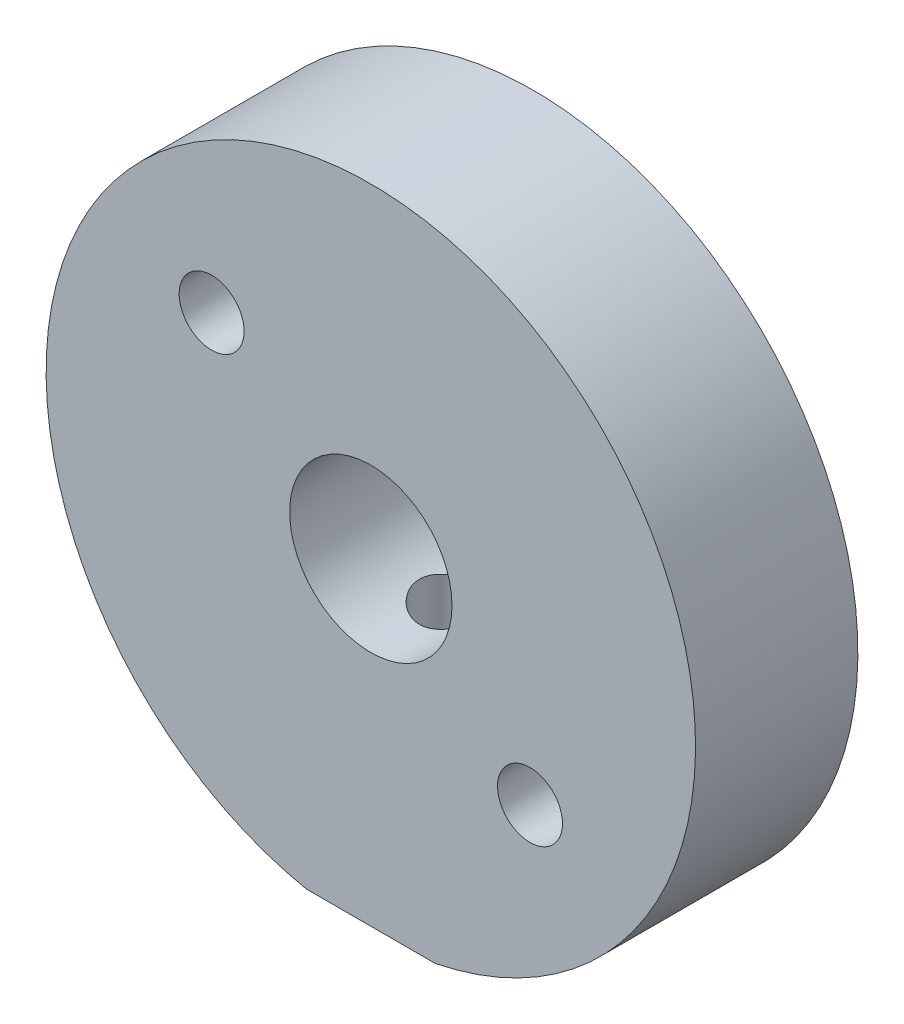
ISO-10303-21;
HEADER;
FILE_DESCRIPTION(('STEP AP214'),'2;1');
FILE_NAME('part.step','',(''),(''),'','','');
FILE_SCHEMA(('AUTOMOTIVE_DESIGN { 1 0 10303 214 1 1 1 1 }'));
ENDSEC;
DATA;
#1=APPLICATION_CONTEXT('core data for automotive mechanical design processes');
#2=APPLICATION_PROTOCOL_DEFINITION('international standard','automotive_design',2000,#1);
#3=PRODUCT_CONTEXT('',#1,'mechanical');
#4=PRODUCT('Part','Part','',(#3));
#5=PRODUCT_RELATED_PRODUCT_CATEGORY('part','',(#4));
#6=PRODUCT_DEFINITION_FORMATION('','',#4);
#7=PRODUCT_DEFINITION_CONTEXT('part definition',#1,'design');
#8=PRODUCT_DEFINITION('design','',#6,#7);
#9=PRODUCT_DEFINITION_SHAPE('','',#8);
#10=(LENGTH_UNIT() NAMED_UNIT(*) SI_UNIT(.MILLI.,.METRE.));
#11=(NAMED_UNIT(*) PLANE_ANGLE_UNIT() SI_UNIT($,.RADIAN.));
#12=(NAMED_UNIT(*) SI_UNIT($,.STERADIAN.) SOLID_ANGLE_UNIT());
#13=UNCERTAINTY_MEASURE_WITH_UNIT(LENGTH_MEASURE(1.E-05),#10,'distance_accuracy_value','');
#14=(GEOMETRIC_REPRESENTATION_CONTEXT(3) GLOBAL_UNCERTAINTY_ASSIGNED_CONTEXT((#13)) GLOBAL_UNIT_ASSIGNED_CONTEXT((#10,
#11,#12)) REPRESENTATION_CONTEXT('',''));
#15=CARTESIAN_POINT('',(0.,0.,0.));
#16=DIRECTION('',(0.,0.,1.));
#17=DIRECTION('',(1.,0.,0.));
#18=AXIS2_PLACEMENT_3D('',#15,#16,#17);
#19=CARTESIAN_POINT('',(0.,0.,1.25));
#20=DIRECTION('',(0.,0.,1.));
#21=DIRECTION('',(1.,0.,0.));
#22=AXIS2_PLACEMENT_3D('',#19,#20,#21);
#23=PLANE('',#22);
#24=DIRECTION('',(-1.,0.,0.));
#25=VECTOR('',#24,1.);
#26=CARTESIAN_POINT('',(0.,-4.9,1.25));
#27=LINE('',#26,#25);
#28=CARTESIAN_POINT('',(0.994987437106618,-4.9,1.25));
#29=VERTEX_POINT('',#28);
#30=CARTESIAN_POINT('',(-0.994987437106618,-4.9,1.25));
#31=VERTEX_POINT('',#30);
#32=EDGE_CURVE('E52',#29,#31,#27,.T.);
#33=ORIENTED_EDGE('',*,*,#32,.F.);
#34=CARTESIAN_POINT('',(0.,0.,1.25));
#35=DIRECTION('',(0.,0.,1.));
#36=DIRECTION('',(1.,0.,0.));
#37=AXIS2_PLACEMENT_3D('',#34,#35,#36);
#38=CIRCLE('',#37,5.);
#39=EDGE_CURVE('E11',#29,#31,#38,.T.);
#40=ORIENTED_EDGE('',*,*,#39,.T.);
#41=EDGE_LOOP('',(#33,#40));
#42=FACE_BOUND('',#41,.T.);
#43=CARTESIAN_POINT('',(-2.45134221797273,2.05692035100051,1.25));
#44=DIRECTION('',(0.,0.,1.));
#45=DIRECTION('',(1.,0.,0.));
#46=AXIS2_PLACEMENT_3D('',#43,#44,#45);
#47=CIRCLE('',#46,0.5);
#48=CARTESIAN_POINT('',(-1.95134221797273,2.05692035100051,1.25));
#49=VERTEX_POINT('',#48);
#50=EDGE_CURVE('E78',#49,#49,#47,.T.);
#51=ORIENTED_EDGE('',*,*,#50,.F.);
#52=EDGE_LOOP('',(#51));
#53=FACE_BOUND('',#52,.T.);
#54=CARTESIAN_POINT('',(2.45134221797309,-2.05692035100051,1.25));
#55=DIRECTION('',(0.,0.,1.));
#56=DIRECTION('',(1.,0.,0.));
#57=AXIS2_PLACEMENT_3D('',#54,#55,#56);
#58=CIRCLE('',#57,0.5);
#59=CARTESIAN_POINT('',(2.95134221797309,-2.05692035100051,1.25));
#60=VERTEX_POINT('',#59);
#61=EDGE_CURVE('E86',#60,#60,#58,.T.);
#62=ORIENTED_EDGE('',*,*,#61,.F.);
#63=EDGE_LOOP('',(#62));
#64=FACE_BOUND('',#63,.T.);
#65=CARTESIAN_POINT('',(0.,0.,1.25));
#66=DIRECTION('',(0.,0.,1.));
#67=DIRECTION('',(1.,0.,0.));
#68=AXIS2_PLACEMENT_3D('',#65,#66,#67);
#69=CIRCLE('',#68,1.25);
#70=CARTESIAN_POINT('',(1.25,0.,1.25));
#71=VERTEX_POINT('',#70);
#72=EDGE_CURVE('E91',#71,#71,#69,.T.);
#73=ORIENTED_EDGE('',*,*,#72,.F.);
#74=EDGE_LOOP('',(#73));
#75=FACE_BOUND('',#74,.T.);
#76=ADVANCED_FACE('F35',(#42,#53,#64,#75),#23,.T.);
#77=CARTESIAN_POINT('',(0.,0.,-1.25));
#78=DIRECTION('',(0.,0.,1.));
#79=DIRECTION('',(1.,0.,0.));
#80=AXIS2_PLACEMENT_3D('',#77,#78,#79);
#81=PLANE('',#80);
#82=CARTESIAN_POINT('',(-2.45134221797273,2.05692035100051,-1.25));
#83=DIRECTION('',(0.,0.,1.));
#84=DIRECTION('',(1.,0.,0.));
#85=AXIS2_PLACEMENT_3D('',#82,#83,#84);
#86=CIRCLE('',#85,0.5);
#87=CARTESIAN_POINT('',(-1.95134221797273,2.05692035100051,-1.25));
#88=VERTEX_POINT('',#87);
#89=EDGE_CURVE('E81',#88,#88,#86,.T.);
#90=ORIENTED_EDGE('',*,*,#89,.T.);
#91=EDGE_LOOP('',(#90));
#92=FACE_BOUND('',#91,.T.);
#93=CARTESIAN_POINT('',(2.45134221797309,-2.05692035100051,-1.25));
#94=DIRECTION('',(0.,0.,1.));
#95=DIRECTION('',(1.,0.,0.));
#96=AXIS2_PLACEMENT_3D('',#93,#94,#95);
#97=CIRCLE('',#96,0.5);
#98=CARTESIAN_POINT('',(2.95134221797309,-2.05692035100051,-1.25));
#99=VERTEX_POINT('',#98);
#100=EDGE_CURVE('E82',#99,#99,#97,.T.);
#101=ORIENTED_EDGE('',*,*,#100,.T.);
#102=EDGE_LOOP('',(#101));
#103=FACE_BOUND('',#102,.T.);
#104=CARTESIAN_POINT('',(0.,0.,-1.25));
#105=DIRECTION('',(0.,0.,1.));
#106=DIRECTION('',(1.,0.,0.));
#107=AXIS2_PLACEMENT_3D('',#104,#105,#106);
#108=CIRCLE('',#107,5.);
#109=CARTESIAN_POINT('',(0.994987437106618,-4.9,-1.25));
#110=VERTEX_POINT('',#109);
#111=CARTESIAN_POINT('',(-0.994987437106618,-4.9,-1.25));
#112=VERTEX_POINT('',#111);
#113=EDGE_CURVE('E44',#110,#112,#108,.T.);
#114=ORIENTED_EDGE('',*,*,#113,.F.);
#115=DIRECTION('',(-1.,0.,0.));
#116=VECTOR('',#115,1.);
#117=CARTESIAN_POINT('',(0.,-4.9,-1.25));
#118=LINE('',#117,#116);
#119=EDGE_CURVE('E64',#110,#112,#118,.T.);
#120=ORIENTED_EDGE('',*,*,#119,.T.);
#121=EDGE_LOOP('',(#114,#120));
#122=FACE_BOUND('',#121,.T.);
#123=CARTESIAN_POINT('',(0.,0.,-1.25));
#124=DIRECTION('',(0.,0.,1.));
#125=DIRECTION('',(1.,0.,0.));
#126=AXIS2_PLACEMENT_3D('',#123,#124,#125);
#127=CIRCLE('',#126,1.25);
#128=CARTESIAN_POINT('',(1.25,0.,-1.25));
#129=VERTEX_POINT('',#128);
#130=EDGE_CURVE('E85',#129,#129,#127,.T.);
#131=ORIENTED_EDGE('',*,*,#130,.T.);
#132=EDGE_LOOP('',(#131));
#133=FACE_BOUND('',#132,.T.);
#134=ADVANCED_FACE('F124',(#92,#103,#122,#133),#81,.F.);
#135=CARTESIAN_POINT('',(0.,0.,1.25));
#136=DIRECTION('',(0.,0.,-1.));
#137=DIRECTION('',(-1.,0.,0.));
#138=AXIS2_PLACEMENT_3D('',#135,#136,#137);
#139=CYLINDRICAL_SURFACE('',#138,5.);
#140=ORIENTED_EDGE('',*,*,#39,.F.);
#141=DIRECTION('',(0.,0.,-1.));
#142=VECTOR('',#141,1.);
#143=CARTESIAN_POINT('',(0.994987437106618,-4.9,1.25));
#144=LINE('',#143,#142);
#145=EDGE_CURVE('E62',#29,#110,#144,.T.);
#146=ORIENTED_EDGE('',*,*,#145,.T.);
#147=ORIENTED_EDGE('',*,*,#113,.T.);
#148=DIRECTION('',(0.,0.,-1.));
#149=VECTOR('',#148,1.);
#150=CARTESIAN_POINT('',(-0.994987437106618,-4.9,1.25));
#151=LINE('',#150,#149);
#152=EDGE_CURVE('E56',#112,#31,#151,.F.);
#153=ORIENTED_EDGE('',*,*,#152,.T.);
#154=EDGE_LOOP('',(#140,#146,#147,#153));
#155=FACE_BOUND('',#154,.T.);
#156=ADVANCED_FACE('F37',(#155),#139,.T.);
#157=CARTESIAN_POINT('',(0.,0.,1.25));
#158=DIRECTION('',(0.,0.,-1.));
#159=DIRECTION('',(-1.,0.,0.));
#160=AXIS2_PLACEMENT_3D('',#157,#158,#159);
#161=CYLINDRICAL_SURFACE('',#160,1.25);
#162=CARTESIAN_POINT('',(0.,-1.25,0.5));
#163=CARTESIAN_POINT('',(0.0268732513607228,-1.24999817806771,0.499997537044069));
#164=CARTESIAN_POINT('',(0.0537931410226683,-1.24912323576733,0.497820561977906));
#165=CARTESIAN_POINT('',(0.106874120104474,-1.2457086327516,0.489188074119691));
#166=CARTESIAN_POINT('',(0.133032944390312,-1.24316444674719,0.482720930228467));
#167=CARTESIAN_POINT('',(0.183738480681851,-1.2366855230328,0.465780980485292));
#168=CARTESIAN_POINT('',(0.20829016540424,-1.23275534091018,0.455321288445817));
#169=CARTESIAN_POINT('',(0.255267992582092,-1.22389152699019,0.430745206668363));
#170=CARTESIAN_POINT('',(0.277694869187748,-1.21895824364514,0.416630086270267));
#171=CARTESIAN_POINT('',(0.320875251892598,-1.20832721542605,0.384441125359766));
#172=CARTESIAN_POINT('',(0.341515568137553,-1.20260574232298,0.366223335939934));
#173=CARTESIAN_POINT('',(0.379543751196181,-1.19115144226549,0.326649999130806));
#174=CARTESIAN_POINT('',(0.396930026783383,-1.18541861113448,0.305292925697065));
#175=CARTESIAN_POINT('',(0.42871864182322,-1.17430697949284,0.258892982439433));
#176=CARTESIAN_POINT('',(0.442953745298868,-1.16895528991238,0.233728378494201));
#177=CARTESIAN_POINT('',(0.466938679759287,-1.15958411796698,0.181115900394989));
#178=CARTESIAN_POINT('',(0.476690641071459,-1.15556400311044,0.15366911803791));
#179=CARTESIAN_POINT('',(0.490974705848967,-1.14956589415205,0.0985719166019743));
#180=CARTESIAN_POINT('',(0.495723491451412,-1.14750355088901,0.0709871911059467));
#181=CARTESIAN_POINT('',(0.500543240410007,-1.14541001012286,0.0153412504231831));
#182=CARTESIAN_POINT('',(0.500616504078305,-1.14537781380692,-0.0127197236562537));
#183=CARTESIAN_POINT('',(0.496247341876136,-1.14727625069999,-0.066439167864511));
#184=CARTESIAN_POINT('',(0.492118828576284,-1.14907043759613,-0.0921289286022577));
#185=CARTESIAN_POINT('',(0.479986720074455,-1.15419046901959,-0.142414889001678));
#186=CARTESIAN_POINT('',(0.471982448701158,-1.15751658080418,-0.167010897027577));
#187=CARTESIAN_POINT('',(0.452173683137768,-1.16539871272133,-0.21500445904901));
#188=CARTESIAN_POINT('',(0.440294965578829,-1.16997844820197,-0.238367309763673));
#189=CARTESIAN_POINT('',(0.413126615183053,-1.17984529097472,-0.282853954090391));
#190=CARTESIAN_POINT('',(0.397835701275211,-1.18513266364212,-0.303976902350702));
#191=CARTESIAN_POINT('',(0.362887649863608,-1.19631684185568,-0.345102432200499));
#192=CARTESIAN_POINT('',(0.342984365742659,-1.20222916244038,-0.364892182361504));
#193=CARTESIAN_POINT('',(0.300078606857548,-1.21364956239571,-0.40092111950051));
#194=CARTESIAN_POINT('',(0.277075516333608,-1.21915756111331,-0.417159599352573));
#195=CARTESIAN_POINT('',(0.228019413151461,-1.22928670316137,-0.445904361853958));
#196=CARTESIAN_POINT('',(0.201915122836619,-1.23388817523854,-0.458330570299263));
#197=CARTESIAN_POINT('',(0.147755941370721,-1.2415370708219,-0.478541965269514));
#198=CARTESIAN_POINT('',(0.119702049212419,-1.24458528365595,-0.486329509389353));
#199=CARTESIAN_POINT('',(0.0642239719019548,-1.24864034876728,-0.496612073854926));
#200=CARTESIAN_POINT('',(0.0368608234963826,-1.2497573645838,-0.499393113563388));
#201=CARTESIAN_POINT('',(-0.0179613274519531,-1.25017119627656,-0.500428275132156));
#202=CARTESIAN_POINT('',(-0.0454203033059766,-1.24946848395566,-0.498683570386886));
#203=CARTESIAN_POINT('',(-0.0983581847805009,-1.24639391765945,-0.490927061861994));
#204=CARTESIAN_POINT('',(-0.123870622943883,-1.24409847836405,-0.485110504912227));
#205=CARTESIAN_POINT('',(-0.17353385701518,-1.23814860351351,-0.469641072922576));
#206=CARTESIAN_POINT('',(-0.197684477556156,-1.23449399339042,-0.459987705082938));
#207=CARTESIAN_POINT('',(-0.244769696454232,-1.22604148692796,-0.436803765079902));
#208=CARTESIAN_POINT('',(-0.267644505689066,-1.22121203995305,-0.423163631988793));
#209=CARTESIAN_POINT('',(-0.310860897811424,-1.21093341186027,-0.392514919024009));
#210=CARTESIAN_POINT('',(-0.33120146018948,-1.20548398276245,-0.375504989270917));
#211=CARTESIAN_POINT('',(-0.370180760758058,-1.19411279410938,-0.337282496760919));
#212=CARTESIAN_POINT('',(-0.3886184834548,-1.18818360361687,-0.315866614617007));
#213=CARTESIAN_POINT('',(-0.421687799350143,-1.17685418223858,-0.2701399792541));
#214=CARTESIAN_POINT('',(-0.436318765322091,-1.17145403861338,-0.245828749939108));
#215=CARTESIAN_POINT('',(-0.461451875492365,-1.16178574997527,-0.194634576333148));
#216=CARTESIAN_POINT('',(-0.471912648675241,-1.15752907798208,-0.167729000118263));
#217=CARTESIAN_POINT('',(-0.488074054968611,-1.15080918446056,-0.112316586989208));
#218=CARTESIAN_POINT('',(-0.49377820132833,-1.14834463943799,-0.0838109485218558));
#219=CARTESIAN_POINT('',(-0.499928904310196,-1.14567939806572,-0.0282180245723256));
#220=CARTESIAN_POINT('',(-0.5007242705732,-1.14532855247117,-0.00117629010593323));
#221=CARTESIAN_POINT('',(-0.497950789821897,-1.146537090132,0.0526362144325935));
#222=CARTESIAN_POINT('',(-0.494382496979107,-1.14809623082494,0.0794070184767689));
#223=CARTESIAN_POINT('',(-0.483267841537776,-1.15281662268511,0.130833047462682));
#224=CARTESIAN_POINT('',(-0.475884373392574,-1.15591207956528,0.15553006860796));
#225=CARTESIAN_POINT('',(-0.457501362122924,-1.16331000308508,0.20334465740366));
#226=CARTESIAN_POINT('',(-0.4465008203485,-1.16761280301594,0.226461786725036));
#227=CARTESIAN_POINT('',(-0.420468190689883,-1.17724652401026,0.27190240481761));
#228=CARTESIAN_POINT('',(-0.405241333789859,-1.18262220578284,0.294104667532598));
#229=CARTESIAN_POINT('',(-0.371473029817887,-1.19365951093085,0.335748329300961));
#230=CARTESIAN_POINT('',(-0.352930583704534,-1.19932122012109,0.355188893032085));
#231=CARTESIAN_POINT('',(-0.311626376568112,-1.21073391771841,0.392050713315897));
#232=CARTESIAN_POINT('',(-0.288669000286534,-1.21646689490544,0.409259326724515));
#233=CARTESIAN_POINT('',(-0.239975080071446,-1.22700101678431,0.439584260655411));
#234=CARTESIAN_POINT('',(-0.21423725113681,-1.23180172773227,0.452698678038133));
#235=CARTESIAN_POINT('',(-0.1611845156238,-1.23984928703965,0.474155553797572));
#236=CARTESIAN_POINT('',(-0.133907904554924,-1.24312340763757,0.482582330890084));
#237=CARTESIAN_POINT('',(-0.078219136570305,-1.24786076552342,0.494659780238567));
#238=CARTESIAN_POINT('',(-0.0498108814647279,-1.24932974873909,0.498325609185975));
#239=CARTESIAN_POINT('',(-0.0142280744727323,-1.24993974876034,0.499848845244569));
#240=CARTESIAN_POINT('',(-0.00711567218518954,-1.25000048242294,0.500000652157299));
#241=CARTESIAN_POINT('',(0.,-1.25,0.5));
#242=B_SPLINE_CURVE_WITH_KNOTS('',3,(#162,#163,#164,#165,#166,#167,#168,#169,#170,#171,#172,
#173,#174,#175,#176,#177,#178,#179,#180,#181,#182,#183,#184,#185,#186,#187,#188,#189,#190,#191,
#192,#193,#194,#195,#196,#197,#198,#199,#200,#201,#202,#203,#204,#205,#206,#207,#208,#209,#210,
#211,#212,#213,#214,#215,#216,#217,#218,#219,#220,#221,#222,#223,#224,#225,#226,#227,#228,#229,
#230,#231,#232,#233,#234,#235,#236,#237,#238,#239,#240,#241),.UNSPECIFIED.,.T.,.F.,(4,2,2,2,2,2,
2,2,2,2,2,2,2,2,2,2,2,2,2,2,2,2,2,2,2,2,2,2,2,2,2,2,2,2,2,2,2,2,2,4),(0.,0.0806007469732678,
0.161420909001984,0.241977864367895,0.322506883919961,0.406493454250993,0.490520987336029,
0.578288147048042,0.66601355779567,0.749760263272071,0.83346576585122,0.91134582100343,
0.989239468140118,1.06872281574704,1.14823605484546,1.23389587296639,1.31957273209933,
1.40694228290702,1.49426739028448,1.57642296132002,1.6585572339252,1.73700113891091,
1.81545512248449,1.89630878349566,1.97719489874742,2.06342118656103,2.14966167260937,
2.23673761283175,2.32374918157086,2.40449918343789,2.48523893136364,2.56278579632795,
2.64035408946893,2.72236367009775,2.80439800332701,2.89175105879061,2.97914465905735,
3.06491075248932,3.15040313096688,3.17174511469801),.UNSPECIFIED.);
#243=CARTESIAN_POINT('',(0.,-1.25,0.5));
#244=VERTEX_POINT('',#243);
#245=EDGE_CURVE('E69',#244,#244,#242,.T.);
#246=ORIENTED_EDGE('',*,*,#245,.F.);
#247=EDGE_LOOP('',(#246));
#248=FACE_BOUND('',#247,.T.);
#249=ORIENTED_EDGE('',*,*,#72,.T.);
#250=EDGE_LOOP('',(#249));
#251=FACE_BOUND('',#250,.T.);
#252=ORIENTED_EDGE('',*,*,#130,.F.);
#253=EDGE_LOOP('',(#252));
#254=FACE_BOUND('',#253,.T.);
#255=ADVANCED_FACE('F101',(#248,#251,#254),#161,.F.);
#256=CARTESIAN_POINT('',(2.45134221797309,-2.05692035100051,-1.25));
#257=DIRECTION('',(0.,0.,1.));
#258=DIRECTION('',(1.,0.,0.));
#259=AXIS2_PLACEMENT_3D('',#256,#257,#258);
#260=CYLINDRICAL_SURFACE('',#259,0.5);
#261=ORIENTED_EDGE('',*,*,#100,.F.);
#262=EDGE_LOOP('',(#261));
#263=FACE_BOUND('',#262,.T.);
#264=ORIENTED_EDGE('',*,*,#61,.T.);
#265=EDGE_LOOP('',(#264));
#266=FACE_BOUND('',#265,.T.);
#267=ADVANCED_FACE('F113',(#263,#266),#260,.F.);
#268=CARTESIAN_POINT('',(-2.45134221797273,2.05692035100051,-1.25));
#269=DIRECTION('',(0.,0.,1.));
#270=DIRECTION('',(1.,0.,0.));
#271=AXIS2_PLACEMENT_3D('',#268,#269,#270);
#272=CYLINDRICAL_SURFACE('',#271,0.5);
#273=ORIENTED_EDGE('',*,*,#89,.F.);
#274=EDGE_LOOP('',(#273));
#275=FACE_BOUND('',#274,.T.);
#276=ORIENTED_EDGE('',*,*,#50,.T.);
#277=EDGE_LOOP('',(#276));
#278=FACE_BOUND('',#277,.T.);
#279=ADVANCED_FACE('F110',(#275,#278),#272,.F.);
#280=CARTESIAN_POINT('',(0.,-5.,0.));
#281=DIRECTION('',(0.,1.,0.));
#282=DIRECTION('',(0.,0.,1.));
#283=AXIS2_PLACEMENT_3D('',#280,#281,#282);
#284=CYLINDRICAL_SURFACE('',#283,0.5);
#285=CARTESIAN_POINT('',(0.,-4.9,0.));
#286=DIRECTION('',(0.,1.,0.));
#287=DIRECTION('',(0.,0.,1.));
#288=AXIS2_PLACEMENT_3D('',#285,#286,#287);
#289=CIRCLE('',#288,0.5);
#290=CARTESIAN_POINT('',(0.,-4.9,0.5));
#291=VERTEX_POINT('',#290);
#292=EDGE_CURVE('E39',#291,#291,#289,.F.);
#293=ORIENTED_EDGE('',*,*,#292,.T.);
#294=EDGE_LOOP('',(#293));
#295=FACE_BOUND('',#294,.T.);
#296=ORIENTED_EDGE('',*,*,#245,.T.);
#297=EDGE_LOOP('',(#296));
#298=FACE_BOUND('',#297,.T.);
#299=ADVANCED_FACE('F105',(#295,#298),#284,.F.);
#300=CARTESIAN_POINT('',(0.,-4.9,-1.25));
#301=DIRECTION('',(0.,1.,0.));
#302=DIRECTION('',(0.,0.,1.));
#303=AXIS2_PLACEMENT_3D('',#300,#301,#302);
#304=PLANE('',#303);
#305=ORIENTED_EDGE('',*,*,#292,.F.);
#306=EDGE_LOOP('',(#305));
#307=FACE_BOUND('',#306,.T.);
#308=ORIENTED_EDGE('',*,*,#32,.T.);
#309=ORIENTED_EDGE('',*,*,#152,.F.);
#310=ORIENTED_EDGE('',*,*,#119,.F.);
#311=ORIENTED_EDGE('',*,*,#145,.F.);
#312=EDGE_LOOP('',(#308,#309,#310,#311));
#313=FACE_BOUND('',#312,.T.);
#314=ADVANCED_FACE('F63',(#307,#313),#304,.F.);
#315=CLOSED_SHELL('',(#76,#134,#156,#255,#267,#279,#299,#314));
#316=MANIFOLD_SOLID_BREP('B2',#315);
#317=ADVANCED_BREP_SHAPE_REPRESENTATION('',(#18,#316),#14);
#318=SHAPE_DEFINITION_REPRESENTATION(#9,#317);
ENDSEC;
END-ISO-10303-21;
